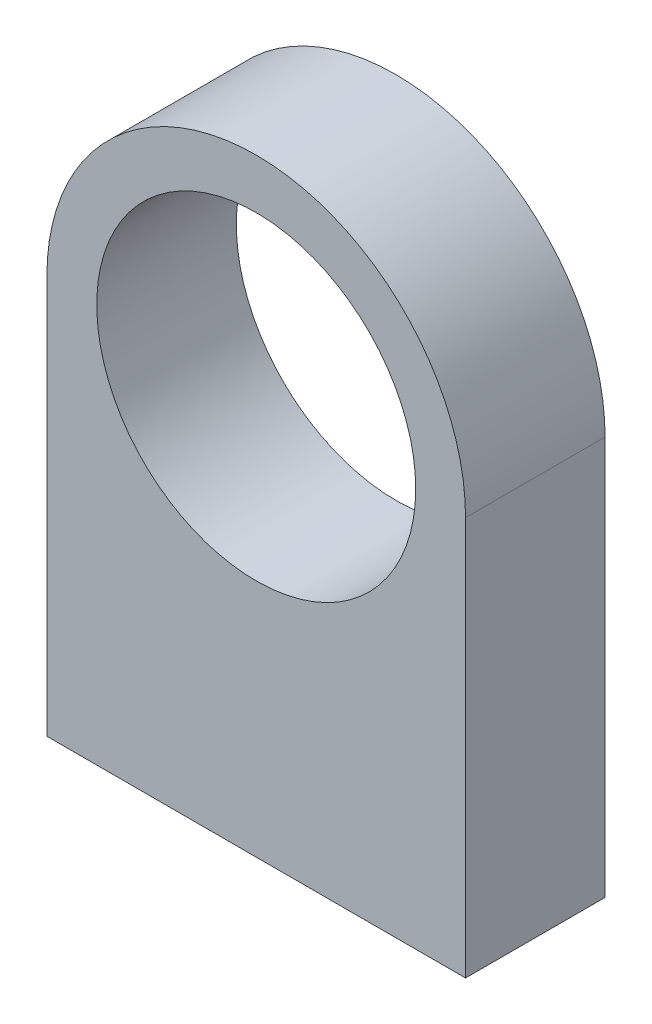
ISO-10303-21;
HEADER;
FILE_DESCRIPTION(('STEP AP214'),'2;1');
FILE_NAME('part.step','',(''),(''),'','','');
FILE_SCHEMA(('AUTOMOTIVE_DESIGN { 1 0 10303 214 1 1 1 1 }'));
ENDSEC;
DATA;
#1=APPLICATION_CONTEXT('core data for automotive mechanical design processes');
#2=APPLICATION_PROTOCOL_DEFINITION('international standard','automotive_design',2000,#1);
#3=PRODUCT_CONTEXT('',#1,'mechanical');
#4=PRODUCT('Part','Part','',(#3));
#5=PRODUCT_RELATED_PRODUCT_CATEGORY('part','',(#4));
#6=PRODUCT_DEFINITION_FORMATION('','',#4);
#7=PRODUCT_DEFINITION_CONTEXT('part definition',#1,'design');
#8=PRODUCT_DEFINITION('design','',#6,#7);
#9=PRODUCT_DEFINITION_SHAPE('','',#8);
#10=(LENGTH_UNIT() NAMED_UNIT(*) SI_UNIT(.MILLI.,.METRE.));
#11=(NAMED_UNIT(*) PLANE_ANGLE_UNIT() SI_UNIT($,.RADIAN.));
#12=(NAMED_UNIT(*) SI_UNIT($,.STERADIAN.) SOLID_ANGLE_UNIT());
#13=UNCERTAINTY_MEASURE_WITH_UNIT(LENGTH_MEASURE(1.E-05),#10,'distance_accuracy_value','');
#14=(GEOMETRIC_REPRESENTATION_CONTEXT(3) GLOBAL_UNCERTAINTY_ASSIGNED_CONTEXT((#13)) GLOBAL_UNIT_ASSIGNED_CONTEXT((#10,
#11,#12)) REPRESENTATION_CONTEXT('',''));
#15=CARTESIAN_POINT('',(0.,0.,0.));
#16=DIRECTION('',(0.,0.,1.));
#17=DIRECTION('',(1.,0.,0.));
#18=AXIS2_PLACEMENT_3D('',#15,#16,#17);
#19=CARTESIAN_POINT('',(0.,10.,3.5));
#20=DIRECTION('',(0.,0.,-1.));
#21=DIRECTION('',(-1.,0.,0.));
#22=AXIS2_PLACEMENT_3D('',#19,#20,#21);
#23=CYLINDRICAL_SURFACE('',#22,10.5);
#24=CARTESIAN_POINT('',(0.,10.,-3.5));
#25=DIRECTION('',(0.,0.,1.));
#26=DIRECTION('',(1.,0.,0.));
#27=AXIS2_PLACEMENT_3D('',#24,#25,#26);
#28=CIRCLE('',#27,10.5);
#29=CARTESIAN_POINT('',(10.5,10.,-3.5));
#30=VERTEX_POINT('',#29);
#31=CARTESIAN_POINT('',(-10.5,10.,-3.5));
#32=VERTEX_POINT('',#31);
#33=EDGE_CURVE('E111',#30,#32,#28,.T.);
#34=ORIENTED_EDGE('',*,*,#33,.T.);
#35=DIRECTION('',(0.,0.,-1.));
#36=VECTOR('',#35,1.);
#37=CARTESIAN_POINT('',(-10.5,10.,3.5));
#38=LINE('',#37,#36);
#39=CARTESIAN_POINT('',(-10.5,10.,3.5));
#40=VERTEX_POINT('',#39);
#41=EDGE_CURVE('E11',#40,#32,#38,.T.);
#42=ORIENTED_EDGE('',*,*,#41,.F.);
#43=CARTESIAN_POINT('',(0.,10.,3.5));
#44=DIRECTION('',(0.,0.,1.));
#45=DIRECTION('',(1.,0.,0.));
#46=AXIS2_PLACEMENT_3D('',#43,#44,#45);
#47=CIRCLE('',#46,10.5);
#48=CARTESIAN_POINT('',(10.5,10.,3.5));
#49=VERTEX_POINT('',#48);
#50=EDGE_CURVE('E100',#49,#40,#47,.T.);
#51=ORIENTED_EDGE('',*,*,#50,.F.);
#52=DIRECTION('',(0.,0.,-1.));
#53=VECTOR('',#52,1.);
#54=CARTESIAN_POINT('',(10.5,10.,3.5));
#55=LINE('',#54,#53);
#56=EDGE_CURVE('E107',#49,#30,#55,.T.);
#57=ORIENTED_EDGE('',*,*,#56,.T.);
#58=EDGE_LOOP('',(#34,#42,#51,#57));
#59=FACE_BOUND('',#58,.T.);
#60=ADVANCED_FACE('F44',(#59),#23,.T.);
#61=CARTESIAN_POINT('',(-10.5,-10.,3.5));
#62=DIRECTION('',(1.,0.,0.));
#63=DIRECTION('',(0.,0.,-1.));
#64=AXIS2_PLACEMENT_3D('',#61,#62,#63);
#65=PLANE('',#64);
#66=DIRECTION('',(0.,-1.,0.));
#67=VECTOR('',#66,1.);
#68=CARTESIAN_POINT('',(-10.5,-10.,-3.5));
#69=LINE('',#68,#67);
#70=CARTESIAN_POINT('',(-10.5,-10.,-3.5));
#71=VERTEX_POINT('',#70);
#72=EDGE_CURVE('E105',#32,#71,#69,.T.);
#73=ORIENTED_EDGE('',*,*,#72,.T.);
#74=DIRECTION('',(0.,0.,-1.));
#75=VECTOR('',#74,1.);
#76=CARTESIAN_POINT('',(-10.5,-10.,3.5));
#77=LINE('',#76,#75);
#78=CARTESIAN_POINT('',(-10.5,-10.,3.5));
#79=VERTEX_POINT('',#78);
#80=EDGE_CURVE('E53',#79,#71,#77,.T.);
#81=ORIENTED_EDGE('',*,*,#80,.F.);
#82=DIRECTION('',(0.,-1.,0.));
#83=VECTOR('',#82,1.);
#84=CARTESIAN_POINT('',(-10.5,-10.,3.5));
#85=LINE('',#84,#83);
#86=EDGE_CURVE('E95',#40,#79,#85,.T.);
#87=ORIENTED_EDGE('',*,*,#86,.F.);
#88=ORIENTED_EDGE('',*,*,#41,.T.);
#89=EDGE_LOOP('',(#73,#81,#87,#88));
#90=FACE_BOUND('',#89,.T.);
#91=ADVANCED_FACE('F102',(#90),#65,.F.);
#92=CARTESIAN_POINT('',(10.5,-10.,3.5));
#93=DIRECTION('',(0.,1.,0.));
#94=DIRECTION('',(0.,0.,1.));
#95=AXIS2_PLACEMENT_3D('',#92,#93,#94);
#96=PLANE('',#95);
#97=DIRECTION('',(1.,0.,0.));
#98=VECTOR('',#97,1.);
#99=CARTESIAN_POINT('',(10.5,-10.,-3.5));
#100=LINE('',#99,#98);
#101=CARTESIAN_POINT('',(10.5,-10.,-3.5));
#102=VERTEX_POINT('',#101);
#103=EDGE_CURVE('E80',#71,#102,#100,.T.);
#104=ORIENTED_EDGE('',*,*,#103,.T.);
#105=DIRECTION('',(0.,0.,-1.));
#106=VECTOR('',#105,1.);
#107=CARTESIAN_POINT('',(10.5,-10.,3.5));
#108=LINE('',#107,#106);
#109=CARTESIAN_POINT('',(10.5,-10.,3.5));
#110=VERTEX_POINT('',#109);
#111=EDGE_CURVE('E101',#110,#102,#108,.T.);
#112=ORIENTED_EDGE('',*,*,#111,.F.);
#113=DIRECTION('',(1.,0.,0.));
#114=VECTOR('',#113,1.);
#115=CARTESIAN_POINT('',(10.5,-10.,3.5));
#116=LINE('',#115,#114);
#117=EDGE_CURVE('E94',#79,#110,#116,.T.);
#118=ORIENTED_EDGE('',*,*,#117,.F.);
#119=ORIENTED_EDGE('',*,*,#80,.T.);
#120=EDGE_LOOP('',(#104,#112,#118,#119));
#121=FACE_BOUND('',#120,.T.);
#122=ADVANCED_FACE('F103',(#121),#96,.F.);
#123=CARTESIAN_POINT('',(10.5,-10.,3.5));
#124=DIRECTION('',(-1.,0.,0.));
#125=DIRECTION('',(0.,0.,1.));
#126=AXIS2_PLACEMENT_3D('',#123,#124,#125);
#127=PLANE('',#126);
#128=DIRECTION('',(0.,1.,0.));
#129=VECTOR('',#128,1.);
#130=CARTESIAN_POINT('',(10.5,-10.,-3.5));
#131=LINE('',#130,#129);
#132=EDGE_CURVE('E82',#102,#30,#131,.T.);
#133=ORIENTED_EDGE('',*,*,#132,.T.);
#134=ORIENTED_EDGE('',*,*,#56,.F.);
#135=DIRECTION('',(0.,1.,0.));
#136=VECTOR('',#135,1.);
#137=CARTESIAN_POINT('',(10.5,-10.,3.5));
#138=LINE('',#137,#136);
#139=EDGE_CURVE('E65',#110,#49,#138,.T.);
#140=ORIENTED_EDGE('',*,*,#139,.F.);
#141=ORIENTED_EDGE('',*,*,#111,.T.);
#142=EDGE_LOOP('',(#133,#134,#140,#141));
#143=FACE_BOUND('',#142,.T.);
#144=ADVANCED_FACE('F130',(#143),#127,.F.);
#145=CARTESIAN_POINT('',(0.,10.,3.5));
#146=DIRECTION('',(0.,0.,1.));
#147=DIRECTION('',(1.,0.,0.));
#148=AXIS2_PLACEMENT_3D('',#145,#146,#147);
#149=PLANE('',#148);
#150=CARTESIAN_POINT('',(0.,10.,3.5));
#151=DIRECTION('',(0.,0.,1.));
#152=DIRECTION('',(1.,0.,0.));
#153=AXIS2_PLACEMENT_3D('',#150,#151,#152);
#154=CIRCLE('',#153,8.);
#155=CARTESIAN_POINT('',(8.,10.,3.5));
#156=VERTEX_POINT('',#155);
#157=EDGE_CURVE('E132',#156,#156,#154,.T.);
#158=ORIENTED_EDGE('',*,*,#157,.F.);
#159=EDGE_LOOP('',(#158));
#160=FACE_BOUND('',#159,.T.);
#161=ORIENTED_EDGE('',*,*,#50,.T.);
#162=ORIENTED_EDGE('',*,*,#86,.T.);
#163=ORIENTED_EDGE('',*,*,#117,.T.);
#164=ORIENTED_EDGE('',*,*,#139,.T.);
#165=EDGE_LOOP('',(#161,#162,#163,#164));
#166=FACE_BOUND('',#165,.T.);
#167=ADVANCED_FACE('F93',(#160,#166),#149,.T.);
#168=CARTESIAN_POINT('',(0.,10.,-3.5));
#169=DIRECTION('',(0.,0.,1.));
#170=DIRECTION('',(1.,0.,0.));
#171=AXIS2_PLACEMENT_3D('',#168,#169,#170);
#172=PLANE('',#171);
#173=CARTESIAN_POINT('',(0.,10.,-3.5));
#174=DIRECTION('',(0.,0.,1.));
#175=DIRECTION('',(1.,0.,0.));
#176=AXIS2_PLACEMENT_3D('',#173,#174,#175);
#177=CIRCLE('',#176,8.);
#178=CARTESIAN_POINT('',(8.,10.,-3.5));
#179=VERTEX_POINT('',#178);
#180=EDGE_CURVE('E120',#179,#179,#177,.T.);
#181=ORIENTED_EDGE('',*,*,#180,.T.);
#182=EDGE_LOOP('',(#181));
#183=FACE_BOUND('',#182,.T.);
#184=ORIENTED_EDGE('',*,*,#33,.F.);
#185=ORIENTED_EDGE('',*,*,#132,.F.);
#186=ORIENTED_EDGE('',*,*,#103,.F.);
#187=ORIENTED_EDGE('',*,*,#72,.F.);
#188=EDGE_LOOP('',(#184,#185,#186,#187));
#189=FACE_BOUND('',#188,.T.);
#190=ADVANCED_FACE('F127',(#183,#189),#172,.F.);
#191=CARTESIAN_POINT('',(0.,10.,-3.5));
#192=DIRECTION('',(0.,0.,1.));
#193=DIRECTION('',(1.,0.,0.));
#194=AXIS2_PLACEMENT_3D('',#191,#192,#193);
#195=CYLINDRICAL_SURFACE('',#194,8.);
#196=ORIENTED_EDGE('',*,*,#180,.F.);
#197=EDGE_LOOP('',(#196));
#198=FACE_BOUND('',#197,.T.);
#199=ORIENTED_EDGE('',*,*,#157,.T.);
#200=EDGE_LOOP('',(#199));
#201=FACE_BOUND('',#200,.T.);
#202=ADVANCED_FACE('F142',(#198,#201),#195,.F.);
#203=CLOSED_SHELL('',(#60,#91,#122,#144,#167,#190,#202));
#204=MANIFOLD_SOLID_BREP('B2',#203);
#205=ADVANCED_BREP_SHAPE_REPRESENTATION('',(#18,#204),#14);
#206=SHAPE_DEFINITION_REPRESENTATION(#9,#205);
ENDSEC;
END-ISO-10303-21;
